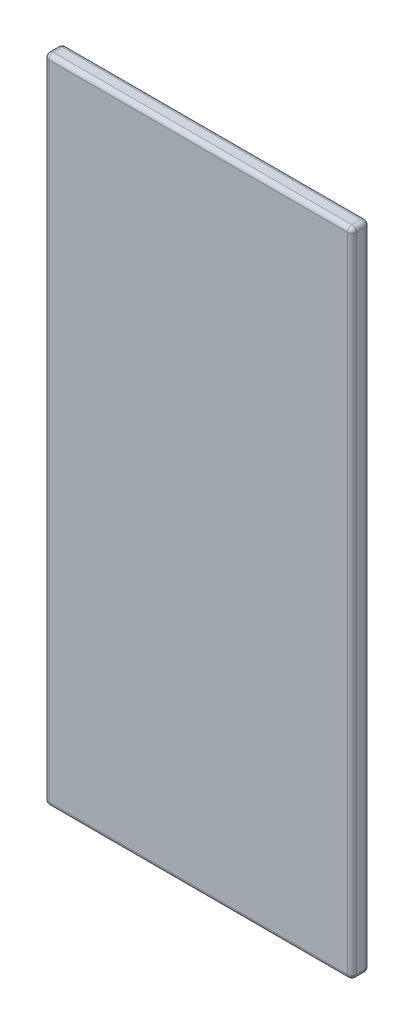
ISO-10303-21;
HEADER;
FILE_DESCRIPTION(('STEP AP214'),'2;1');
FILE_NAME('part.step','',(''),(''),'','','');
FILE_SCHEMA(('AUTOMOTIVE_DESIGN { 1 0 10303 214 1 1 1 1 }'));
ENDSEC;
DATA;
#1=APPLICATION_CONTEXT('core data for automotive mechanical design processes');
#2=APPLICATION_PROTOCOL_DEFINITION('international standard','automotive_design',2000,#1);
#3=PRODUCT_CONTEXT('',#1,'mechanical');
#4=PRODUCT('Part','Part','',(#3));
#5=PRODUCT_RELATED_PRODUCT_CATEGORY('part','',(#4));
#6=PRODUCT_DEFINITION_FORMATION('','',#4);
#7=PRODUCT_DEFINITION_CONTEXT('part definition',#1,'design');
#8=PRODUCT_DEFINITION('design','',#6,#7);
#9=PRODUCT_DEFINITION_SHAPE('','',#8);
#10=(LENGTH_UNIT() NAMED_UNIT(*) SI_UNIT(.MILLI.,.METRE.));
#11=(NAMED_UNIT(*) PLANE_ANGLE_UNIT() SI_UNIT($,.RADIAN.));
#12=(NAMED_UNIT(*) SI_UNIT($,.STERADIAN.) SOLID_ANGLE_UNIT());
#13=UNCERTAINTY_MEASURE_WITH_UNIT(LENGTH_MEASURE(1.E-05),#10,'distance_accuracy_value','');
#14=(GEOMETRIC_REPRESENTATION_CONTEXT(3) GLOBAL_UNCERTAINTY_ASSIGNED_CONTEXT((#13)) GLOBAL_UNIT_ASSIGNED_CONTEXT((#10,
#11,#12)) REPRESENTATION_CONTEXT('',''));
#15=CARTESIAN_POINT('',(0.,0.,0.));
#16=DIRECTION('',(0.,0.,1.));
#17=DIRECTION('',(1.,0.,0.));
#18=AXIS2_PLACEMENT_3D('',#15,#16,#17);
#19=CARTESIAN_POINT('',(17.35,-36.75,2.));
#20=DIRECTION('',(-1.,0.,0.));
#21=DIRECTION('',(0.,0.,1.));
#22=AXIS2_PLACEMENT_3D('',#19,#20,#21);
#23=PLANE('',#22);
#24=DIRECTION('',(0.,1.,0.));
#25=VECTOR('',#24,1.);
#26=CARTESIAN_POINT('',(17.35,-36.75,1.5));
#27=LINE('',#26,#25);
#28=CARTESIAN_POINT('',(17.35,36.25,1.5));
#29=VERTEX_POINT('',#28);
#30=CARTESIAN_POINT('',(17.35,-36.25,1.5));
#31=VERTEX_POINT('',#30);
#32=EDGE_CURVE('E44',#29,#31,#27,.F.);
#33=ORIENTED_EDGE('',*,*,#32,.T.);
#34=DIRECTION('',(0.,0.,-1.));
#35=VECTOR('',#34,1.);
#36=CARTESIAN_POINT('',(17.35,-36.25,2.));
#37=LINE('',#36,#35);
#38=CARTESIAN_POINT('',(17.35,-36.25,0.5));
#39=VERTEX_POINT('',#38);
#40=EDGE_CURVE('E11',#31,#39,#37,.T.);
#41=ORIENTED_EDGE('',*,*,#40,.T.);
#42=DIRECTION('',(0.,1.,0.));
#43=VECTOR('',#42,1.);
#44=CARTESIAN_POINT('',(17.35,36.75,0.5));
#45=LINE('',#44,#43);
#46=CARTESIAN_POINT('',(17.35,36.25,0.5));
#47=VERTEX_POINT('',#46);
#48=EDGE_CURVE('E196',#39,#47,#45,.T.);
#49=ORIENTED_EDGE('',*,*,#48,.T.);
#50=DIRECTION('',(0.,0.,-1.));
#51=VECTOR('',#50,1.);
#52=CARTESIAN_POINT('',(17.35,36.25,2.));
#53=LINE('',#52,#51);
#54=EDGE_CURVE('E55',#47,#29,#53,.F.);
#55=ORIENTED_EDGE('',*,*,#54,.T.);
#56=EDGE_LOOP('',(#33,#41,#49,#55));
#57=FACE_BOUND('',#56,.T.);
#58=ADVANCED_FACE('F35',(#57),#23,.F.);
#59=CARTESIAN_POINT('',(-17.35,36.75,2.));
#60=DIRECTION('',(0.,-1.,0.));
#61=DIRECTION('',(0.,0.,-1.));
#62=AXIS2_PLACEMENT_3D('',#59,#60,#61);
#63=PLANE('',#62);
#64=DIRECTION('',(0.,0.,-1.));
#65=VECTOR('',#64,1.);
#66=CARTESIAN_POINT('',(-16.85,36.75,2.));
#67=LINE('',#66,#65);
#68=CARTESIAN_POINT('',(-16.85,36.75,0.5));
#69=VERTEX_POINT('',#68);
#70=CARTESIAN_POINT('',(-16.85,36.75,1.5));
#71=VERTEX_POINT('',#70);
#72=EDGE_CURVE('E191',#69,#71,#67,.F.);
#73=ORIENTED_EDGE('',*,*,#72,.T.);
#74=DIRECTION('',(-1.,0.,0.));
#75=VECTOR('',#74,1.);
#76=CARTESIAN_POINT('',(-17.35,36.75,1.5));
#77=LINE('',#76,#75);
#78=CARTESIAN_POINT('',(16.85,36.75,1.5));
#79=VERTEX_POINT('',#78);
#80=EDGE_CURVE('E193',#71,#79,#77,.F.);
#81=ORIENTED_EDGE('',*,*,#80,.T.);
#82=DIRECTION('',(0.,0.,-1.));
#83=VECTOR('',#82,1.);
#84=CARTESIAN_POINT('',(16.85,36.75,2.));
#85=LINE('',#84,#83);
#86=CARTESIAN_POINT('',(16.85,36.75,0.5));
#87=VERTEX_POINT('',#86);
#88=EDGE_CURVE('E187',#79,#87,#85,.T.);
#89=ORIENTED_EDGE('',*,*,#88,.T.);
#90=DIRECTION('',(-1.,0.,0.));
#91=VECTOR('',#90,1.);
#92=CARTESIAN_POINT('',(-17.35,36.75,0.5));
#93=LINE('',#92,#91);
#94=EDGE_CURVE('E189',#87,#69,#93,.T.);
#95=ORIENTED_EDGE('',*,*,#94,.T.);
#96=EDGE_LOOP('',(#73,#81,#89,#95));
#97=FACE_BOUND('',#96,.T.);
#98=ADVANCED_FACE('F280',(#97),#63,.F.);
#99=CARTESIAN_POINT('',(-17.35,-36.75,2.));
#100=DIRECTION('',(1.,0.,0.));
#101=DIRECTION('',(0.,0.,-1.));
#102=AXIS2_PLACEMENT_3D('',#99,#100,#101);
#103=PLANE('',#102);
#104=DIRECTION('',(0.,0.,-1.));
#105=VECTOR('',#104,1.);
#106=CARTESIAN_POINT('',(-17.35,-36.25,2.));
#107=LINE('',#106,#105);
#108=CARTESIAN_POINT('',(-17.35,-36.25,0.5));
#109=VERTEX_POINT('',#108);
#110=CARTESIAN_POINT('',(-17.35,-36.25,1.5));
#111=VERTEX_POINT('',#110);
#112=EDGE_CURVE('E182',#109,#111,#107,.F.);
#113=ORIENTED_EDGE('',*,*,#112,.T.);
#114=DIRECTION('',(0.,-1.,0.));
#115=VECTOR('',#114,1.);
#116=CARTESIAN_POINT('',(-17.35,-36.75,1.5));
#117=LINE('',#116,#115);
#118=CARTESIAN_POINT('',(-17.35,36.25,1.5));
#119=VERTEX_POINT('',#118);
#120=EDGE_CURVE('E184',#111,#119,#117,.F.);
#121=ORIENTED_EDGE('',*,*,#120,.T.);
#122=DIRECTION('',(0.,0.,-1.));
#123=VECTOR('',#122,1.);
#124=CARTESIAN_POINT('',(-17.35,36.25,2.));
#125=LINE('',#124,#123);
#126=CARTESIAN_POINT('',(-17.35,36.25,0.5));
#127=VERTEX_POINT('',#126);
#128=EDGE_CURVE('E178',#119,#127,#125,.T.);
#129=ORIENTED_EDGE('',*,*,#128,.T.);
#130=DIRECTION('',(0.,-1.,0.));
#131=VECTOR('',#130,1.);
#132=CARTESIAN_POINT('',(-17.35,-36.75,0.5));
#133=LINE('',#132,#131);
#134=EDGE_CURVE('E180',#127,#109,#133,.T.);
#135=ORIENTED_EDGE('',*,*,#134,.T.);
#136=EDGE_LOOP('',(#113,#121,#129,#135));
#137=FACE_BOUND('',#136,.T.);
#138=ADVANCED_FACE('F271',(#137),#103,.F.);
#139=CARTESIAN_POINT('',(-17.35,-36.75,2.));
#140=DIRECTION('',(0.,1.,0.));
#141=DIRECTION('',(0.,0.,1.));
#142=AXIS2_PLACEMENT_3D('',#139,#140,#141);
#143=PLANE('',#142);
#144=DIRECTION('',(1.,0.,0.));
#145=VECTOR('',#144,1.);
#146=CARTESIAN_POINT('',(-17.35,-36.75,1.5));
#147=LINE('',#146,#145);
#148=CARTESIAN_POINT('',(16.85,-36.75,1.5));
#149=VERTEX_POINT('',#148);
#150=CARTESIAN_POINT('',(-16.85,-36.75,1.5));
#151=VERTEX_POINT('',#150);
#152=EDGE_CURVE('E131',#149,#151,#147,.F.);
#153=ORIENTED_EDGE('',*,*,#152,.T.);
#154=DIRECTION('',(0.,0.,-1.));
#155=VECTOR('',#154,1.);
#156=CARTESIAN_POINT('',(-16.85,-36.75,2.));
#157=LINE('',#156,#155);
#158=CARTESIAN_POINT('',(-16.85,-36.75,0.5));
#159=VERTEX_POINT('',#158);
#160=EDGE_CURVE('E167',#151,#159,#157,.T.);
#161=ORIENTED_EDGE('',*,*,#160,.T.);
#162=DIRECTION('',(1.,0.,0.));
#163=VECTOR('',#162,1.);
#164=CARTESIAN_POINT('',(17.35,-36.75,0.5));
#165=LINE('',#164,#163);
#166=CARTESIAN_POINT('',(16.85,-36.75,0.5));
#167=VERTEX_POINT('',#166);
#168=EDGE_CURVE('E160',#159,#167,#165,.T.);
#169=ORIENTED_EDGE('',*,*,#168,.T.);
#170=DIRECTION('',(0.,0.,-1.));
#171=VECTOR('',#170,1.);
#172=CARTESIAN_POINT('',(16.85,-36.75,2.));
#173=LINE('',#172,#171);
#174=EDGE_CURVE('E158',#167,#149,#173,.F.);
#175=ORIENTED_EDGE('',*,*,#174,.T.);
#176=EDGE_LOOP('',(#153,#161,#169,#175));
#177=FACE_BOUND('',#176,.T.);
#178=ADVANCED_FACE('F358',(#177),#143,.F.);
#179=CARTESIAN_POINT('',(0.,0.,2.));
#180=DIRECTION('',(0.,0.,-1.));
#181=DIRECTION('',(-1.,0.,0.));
#182=AXIS2_PLACEMENT_3D('',#179,#180,#181);
#183=PLANE('',#182);
#184=DIRECTION('',(0.,-1.,0.));
#185=VECTOR('',#184,1.);
#186=CARTESIAN_POINT('',(-16.85,0.,2.));
#187=LINE('',#186,#185);
#188=CARTESIAN_POINT('',(-16.85,36.25,2.));
#189=VERTEX_POINT('',#188);
#190=CARTESIAN_POINT('',(-16.85,-36.25,2.));
#191=VERTEX_POINT('',#190);
#192=EDGE_CURVE('E156',#189,#191,#187,.T.);
#193=ORIENTED_EDGE('',*,*,#192,.T.);
#194=DIRECTION('',(1.,0.,0.));
#195=VECTOR('',#194,1.);
#196=CARTESIAN_POINT('',(0.,-36.25,2.));
#197=LINE('',#196,#195);
#198=CARTESIAN_POINT('',(16.85,-36.25,2.));
#199=VERTEX_POINT('',#198);
#200=EDGE_CURVE('E129',#191,#199,#197,.T.);
#201=ORIENTED_EDGE('',*,*,#200,.T.);
#202=DIRECTION('',(0.,1.,0.));
#203=VECTOR('',#202,1.);
#204=CARTESIAN_POINT('',(16.85,0.,2.));
#205=LINE('',#204,#203);
#206=CARTESIAN_POINT('',(16.85,36.25,2.));
#207=VERTEX_POINT('',#206);
#208=EDGE_CURVE('E146',#199,#207,#205,.T.);
#209=ORIENTED_EDGE('',*,*,#208,.T.);
#210=DIRECTION('',(-1.,0.,0.));
#211=VECTOR('',#210,1.);
#212=CARTESIAN_POINT('',(0.,36.25,2.));
#213=LINE('',#212,#211);
#214=EDGE_CURVE('E152',#207,#189,#213,.T.);
#215=ORIENTED_EDGE('',*,*,#214,.T.);
#216=EDGE_LOOP('',(#193,#201,#209,#215));
#217=FACE_BOUND('',#216,.T.);
#218=ADVANCED_FACE('F154',(#217),#183,.F.);
#219=CARTESIAN_POINT('',(0.,0.,0.));
#220=DIRECTION('',(0.,0.,-1.));
#221=DIRECTION('',(-1.,0.,0.));
#222=AXIS2_PLACEMENT_3D('',#219,#220,#221);
#223=PLANE('',#222);
#224=DIRECTION('',(0.,1.,0.));
#225=VECTOR('',#224,1.);
#226=CARTESIAN_POINT('',(16.85,-36.75,0.));
#227=LINE('',#226,#225);
#228=CARTESIAN_POINT('',(16.85,36.25,0.));
#229=VERTEX_POINT('',#228);
#230=CARTESIAN_POINT('',(16.85,-36.25,0.));
#231=VERTEX_POINT('',#230);
#232=EDGE_CURVE('E169',#229,#231,#227,.F.);
#233=ORIENTED_EDGE('',*,*,#232,.T.);
#234=DIRECTION('',(1.,0.,0.));
#235=VECTOR('',#234,1.);
#236=CARTESIAN_POINT('',(-17.35,-36.25,0.));
#237=LINE('',#236,#235);
#238=CARTESIAN_POINT('',(-16.85,-36.25,0.));
#239=VERTEX_POINT('',#238);
#240=EDGE_CURVE('E175',#231,#239,#237,.F.);
#241=ORIENTED_EDGE('',*,*,#240,.T.);
#242=DIRECTION('',(0.,-1.,0.));
#243=VECTOR('',#242,1.);
#244=CARTESIAN_POINT('',(-16.85,36.75,0.));
#245=LINE('',#244,#243);
#246=CARTESIAN_POINT('',(-16.85,36.25,0.));
#247=VERTEX_POINT('',#246);
#248=EDGE_CURVE('E173',#239,#247,#245,.F.);
#249=ORIENTED_EDGE('',*,*,#248,.T.);
#250=DIRECTION('',(-1.,0.,0.));
#251=VECTOR('',#250,1.);
#252=CARTESIAN_POINT('',(17.35,36.25,0.));
#253=LINE('',#252,#251);
#254=EDGE_CURVE('E171',#247,#229,#253,.F.);
#255=ORIENTED_EDGE('',*,*,#254,.T.);
#256=EDGE_LOOP('',(#233,#241,#249,#255));
#257=FACE_BOUND('',#256,.T.);
#258=ADVANCED_FACE('F298',(#257),#223,.T.);
#259=CARTESIAN_POINT('',(-17.35,36.25,0.5));
#260=DIRECTION('',(1.,0.,0.));
#261=DIRECTION('',(0.,0.,-1.));
#262=AXIS2_PLACEMENT_3D('',#259,#260,#261);
#263=CYLINDRICAL_SURFACE('',#262,0.5);
#264=CARTESIAN_POINT('',(-16.85,36.25,0.5));
#265=DIRECTION('',(-1.,0.,0.));
#266=DIRECTION('',(0.,0.,1.));
#267=AXIS2_PLACEMENT_3D('',#264,#265,#266);
#268=CIRCLE('',#267,0.5);
#269=EDGE_CURVE('E39',#69,#247,#268,.T.);
#270=ORIENTED_EDGE('',*,*,#269,.F.);
#271=ORIENTED_EDGE('',*,*,#94,.F.);
#272=CARTESIAN_POINT('',(16.85,36.25,0.5));
#273=DIRECTION('',(1.,0.,0.));
#274=DIRECTION('',(0.,0.,-1.));
#275=AXIS2_PLACEMENT_3D('',#272,#273,#274);
#276=CIRCLE('',#275,0.5);
#277=EDGE_CURVE('E248',#229,#87,#276,.T.);
#278=ORIENTED_EDGE('',*,*,#277,.F.);
#279=ORIENTED_EDGE('',*,*,#254,.F.);
#280=EDGE_LOOP('',(#270,#271,#278,#279));
#281=FACE_BOUND('',#280,.T.);
#282=ADVANCED_FACE('F37',(#281),#263,.T.);
#283=CARTESIAN_POINT('',(-16.85,36.25,0.5));
#284=DIRECTION('',(0.,0.,1.));
#285=DIRECTION('',(1.,0.,0.));
#286=AXIS2_PLACEMENT_3D('',#283,#284,#285);
#287=SPHERICAL_SURFACE('',#286,0.5);
#288=CARTESIAN_POINT('',(-16.85,36.25,0.5));
#289=DIRECTION('',(0.,0.,-1.));
#290=DIRECTION('',(-1.,0.,0.));
#291=AXIS2_PLACEMENT_3D('',#288,#289,#290);
#292=CIRCLE('',#291,0.5);
#293=EDGE_CURVE('E243',#69,#127,#292,.F.);
#294=ORIENTED_EDGE('',*,*,#293,.F.);
#295=ORIENTED_EDGE('',*,*,#269,.T.);
#296=CARTESIAN_POINT('',(-16.85,36.25,0.5));
#297=DIRECTION('',(0.,1.,0.));
#298=DIRECTION('',(0.,0.,1.));
#299=AXIS2_PLACEMENT_3D('',#296,#297,#298);
#300=CIRCLE('',#299,0.5);
#301=EDGE_CURVE('E246',#127,#247,#300,.F.);
#302=ORIENTED_EDGE('',*,*,#301,.F.);
#303=EDGE_LOOP('',(#294,#295,#302));
#304=FACE_BOUND('',#303,.T.);
#305=ADVANCED_FACE('F259',(#304),#287,.T.);
#306=CARTESIAN_POINT('',(16.85,36.25,0.5));
#307=DIRECTION('',(0.,0.,1.));
#308=DIRECTION('',(1.,0.,0.));
#309=AXIS2_PLACEMENT_3D('',#306,#307,#308);
#310=SPHERICAL_SURFACE('',#309,0.5);
#311=CARTESIAN_POINT('',(16.85,36.25,0.5));
#312=DIRECTION('',(0.,1.,0.));
#313=DIRECTION('',(0.,0.,1.));
#314=AXIS2_PLACEMENT_3D('',#311,#312,#313);
#315=CIRCLE('',#314,0.5);
#316=EDGE_CURVE('E237',#229,#47,#315,.F.);
#317=ORIENTED_EDGE('',*,*,#316,.F.);
#318=ORIENTED_EDGE('',*,*,#277,.T.);
#319=CARTESIAN_POINT('',(16.85,36.25,0.5));
#320=DIRECTION('',(0.,0.,-1.));
#321=DIRECTION('',(-1.,0.,0.));
#322=AXIS2_PLACEMENT_3D('',#319,#320,#321);
#323=CIRCLE('',#322,0.5);
#324=EDGE_CURVE('E240',#47,#87,#323,.F.);
#325=ORIENTED_EDGE('',*,*,#324,.F.);
#326=EDGE_LOOP('',(#317,#318,#325));
#327=FACE_BOUND('',#326,.T.);
#328=ADVANCED_FACE('F291',(#327),#310,.T.);
#329=CARTESIAN_POINT('',(-16.85,-36.75,0.5));
#330=DIRECTION('',(0.,1.,0.));
#331=DIRECTION('',(0.,0.,1.));
#332=AXIS2_PLACEMENT_3D('',#329,#330,#331);
#333=CYLINDRICAL_SURFACE('',#332,0.5);
#334=ORIENTED_EDGE('',*,*,#301,.T.);
#335=ORIENTED_EDGE('',*,*,#248,.F.);
#336=CARTESIAN_POINT('',(-16.85,-36.25,0.5));
#337=DIRECTION('',(0.,-1.,0.));
#338=DIRECTION('',(0.,0.,-1.));
#339=AXIS2_PLACEMENT_3D('',#336,#337,#338);
#340=CIRCLE('',#339,0.5);
#341=EDGE_CURVE('E232',#109,#239,#340,.T.);
#342=ORIENTED_EDGE('',*,*,#341,.F.);
#343=ORIENTED_EDGE('',*,*,#134,.F.);
#344=EDGE_LOOP('',(#334,#335,#342,#343));
#345=FACE_BOUND('',#344,.T.);
#346=ADVANCED_FACE('F267',(#345),#333,.T.);
#347=CARTESIAN_POINT('',(-16.85,36.25,2.));
#348=DIRECTION('',(0.,0.,-1.));
#349=DIRECTION('',(-1.,0.,0.));
#350=AXIS2_PLACEMENT_3D('',#347,#348,#349);
#351=CYLINDRICAL_SURFACE('',#350,0.5);
#352=ORIENTED_EDGE('',*,*,#293,.T.);
#353=ORIENTED_EDGE('',*,*,#128,.F.);
#354=CARTESIAN_POINT('',(-16.85,36.25,1.5));
#355=DIRECTION('',(0.,0.,1.));
#356=DIRECTION('',(1.,0.,0.));
#357=AXIS2_PLACEMENT_3D('',#354,#355,#356);
#358=CIRCLE('',#357,0.5);
#359=EDGE_CURVE('E229',#71,#119,#358,.T.);
#360=ORIENTED_EDGE('',*,*,#359,.F.);
#361=ORIENTED_EDGE('',*,*,#72,.F.);
#362=EDGE_LOOP('',(#352,#353,#360,#361));
#363=FACE_BOUND('',#362,.T.);
#364=ADVANCED_FACE('F277',(#363),#351,.T.);
#365=CARTESIAN_POINT('',(0.,36.25,1.5));
#366=DIRECTION('',(-1.,0.,0.));
#367=DIRECTION('',(0.,0.,1.));
#368=AXIS2_PLACEMENT_3D('',#365,#366,#367);
#369=CYLINDRICAL_SURFACE('',#368,0.5);
#370=CARTESIAN_POINT('',(16.85,36.25,1.5));
#371=DIRECTION('',(1.,0.,0.));
#372=DIRECTION('',(0.,0.,-1.));
#373=AXIS2_PLACEMENT_3D('',#370,#371,#372);
#374=CIRCLE('',#373,0.5);
#375=EDGE_CURVE('E223',#79,#207,#374,.T.);
#376=ORIENTED_EDGE('',*,*,#375,.F.);
#377=ORIENTED_EDGE('',*,*,#80,.F.);
#378=CARTESIAN_POINT('',(-16.85,36.25,1.5));
#379=DIRECTION('',(-1.,0.,0.));
#380=DIRECTION('',(0.,0.,1.));
#381=AXIS2_PLACEMENT_3D('',#378,#379,#380);
#382=CIRCLE('',#381,0.5);
#383=EDGE_CURVE('E226',#189,#71,#382,.T.);
#384=ORIENTED_EDGE('',*,*,#383,.F.);
#385=ORIENTED_EDGE('',*,*,#214,.F.);
#386=EDGE_LOOP('',(#376,#377,#384,#385));
#387=FACE_BOUND('',#386,.T.);
#388=ADVANCED_FACE('F284',(#387),#369,.T.);
#389=CARTESIAN_POINT('',(16.85,36.25,2.));
#390=DIRECTION('',(0.,0.,-1.));
#391=DIRECTION('',(-1.,0.,0.));
#392=AXIS2_PLACEMENT_3D('',#389,#390,#391);
#393=CYLINDRICAL_SURFACE('',#392,0.5);
#394=ORIENTED_EDGE('',*,*,#324,.T.);
#395=ORIENTED_EDGE('',*,*,#88,.F.);
#396=CARTESIAN_POINT('',(16.85,36.25,1.5));
#397=DIRECTION('',(0.,0.,1.));
#398=DIRECTION('',(1.,0.,0.));
#399=AXIS2_PLACEMENT_3D('',#396,#397,#398);
#400=CIRCLE('',#399,0.5);
#401=EDGE_CURVE('E221',#29,#79,#400,.T.);
#402=ORIENTED_EDGE('',*,*,#401,.F.);
#403=ORIENTED_EDGE('',*,*,#54,.F.);
#404=EDGE_LOOP('',(#394,#395,#402,#403));
#405=FACE_BOUND('',#404,.T.);
#406=ADVANCED_FACE('F289',(#405),#393,.T.);
#407=CARTESIAN_POINT('',(16.85,-36.75,0.5));
#408=DIRECTION('',(0.,-1.,0.));
#409=DIRECTION('',(0.,0.,-1.));
#410=AXIS2_PLACEMENT_3D('',#407,#408,#409);
#411=CYLINDRICAL_SURFACE('',#410,0.5);
#412=ORIENTED_EDGE('',*,*,#316,.T.);
#413=ORIENTED_EDGE('',*,*,#48,.F.);
#414=CARTESIAN_POINT('',(16.85,-36.25,0.5));
#415=DIRECTION('',(0.,-1.,0.));
#416=DIRECTION('',(0.,0.,-1.));
#417=AXIS2_PLACEMENT_3D('',#414,#415,#416);
#418=CIRCLE('',#417,0.5);
#419=EDGE_CURVE('E218',#231,#39,#418,.T.);
#420=ORIENTED_EDGE('',*,*,#419,.F.);
#421=ORIENTED_EDGE('',*,*,#232,.F.);
#422=EDGE_LOOP('',(#412,#413,#420,#421));
#423=FACE_BOUND('',#422,.T.);
#424=ADVANCED_FACE('F295',(#423),#411,.T.);
#425=CARTESIAN_POINT('',(-17.35,-36.25,0.5));
#426=DIRECTION('',(-1.,0.,0.));
#427=DIRECTION('',(0.,0.,1.));
#428=AXIS2_PLACEMENT_3D('',#425,#426,#427);
#429=CYLINDRICAL_SURFACE('',#428,0.5);
#430=CARTESIAN_POINT('',(-16.85,-36.25,0.5));
#431=DIRECTION('',(-1.,0.,0.));
#432=DIRECTION('',(0.,0.,1.));
#433=AXIS2_PLACEMENT_3D('',#430,#431,#432);
#434=CIRCLE('',#433,0.5);
#435=EDGE_CURVE('E234',#239,#159,#434,.T.);
#436=ORIENTED_EDGE('',*,*,#435,.F.);
#437=ORIENTED_EDGE('',*,*,#240,.F.);
#438=CARTESIAN_POINT('',(16.85,-36.25,0.5));
#439=DIRECTION('',(1.,0.,0.));
#440=DIRECTION('',(0.,0.,-1.));
#441=AXIS2_PLACEMENT_3D('',#438,#439,#440);
#442=CIRCLE('',#441,0.5);
#443=EDGE_CURVE('E215',#167,#231,#442,.T.);
#444=ORIENTED_EDGE('',*,*,#443,.F.);
#445=ORIENTED_EDGE('',*,*,#168,.F.);
#446=EDGE_LOOP('',(#436,#437,#444,#445));
#447=FACE_BOUND('',#446,.T.);
#448=ADVANCED_FACE('F302',(#447),#429,.T.);
#449=CARTESIAN_POINT('',(-16.85,-36.25,0.5));
#450=DIRECTION('',(0.,0.,1.));
#451=DIRECTION('',(1.,0.,0.));
#452=AXIS2_PLACEMENT_3D('',#449,#450,#451);
#453=SPHERICAL_SURFACE('',#452,0.5);
#454=ORIENTED_EDGE('',*,*,#341,.T.);
#455=ORIENTED_EDGE('',*,*,#435,.T.);
#456=CARTESIAN_POINT('',(-16.85,-36.25,0.5));
#457=DIRECTION('',(0.,0.,-1.));
#458=DIRECTION('',(-1.,0.,0.));
#459=AXIS2_PLACEMENT_3D('',#456,#457,#458);
#460=CIRCLE('',#459,0.5);
#461=EDGE_CURVE('E212',#109,#159,#460,.F.);
#462=ORIENTED_EDGE('',*,*,#461,.F.);
#463=EDGE_LOOP('',(#454,#455,#462));
#464=FACE_BOUND('',#463,.T.);
#465=ADVANCED_FACE('F306',(#464),#453,.T.);
#466=CARTESIAN_POINT('',(-16.85,36.25,1.5));
#467=DIRECTION('',(0.,0.,1.));
#468=DIRECTION('',(1.,0.,0.));
#469=AXIS2_PLACEMENT_3D('',#466,#467,#468);
#470=SPHERICAL_SURFACE('',#469,0.5);
#471=ORIENTED_EDGE('',*,*,#383,.T.);
#472=ORIENTED_EDGE('',*,*,#359,.T.);
#473=CARTESIAN_POINT('',(-16.85,36.25,1.5));
#474=DIRECTION('',(0.,1.,0.));
#475=DIRECTION('',(0.,0.,1.));
#476=AXIS2_PLACEMENT_3D('',#473,#474,#475);
#477=CIRCLE('',#476,0.5);
#478=EDGE_CURVE('E210',#189,#119,#477,.F.);
#479=ORIENTED_EDGE('',*,*,#478,.F.);
#480=EDGE_LOOP('',(#471,#472,#479));
#481=FACE_BOUND('',#480,.T.);
#482=ADVANCED_FACE('F317',(#481),#470,.T.);
#483=CARTESIAN_POINT('',(16.85,36.25,1.5));
#484=DIRECTION('',(0.,0.,1.));
#485=DIRECTION('',(1.,0.,0.));
#486=AXIS2_PLACEMENT_3D('',#483,#484,#485);
#487=SPHERICAL_SURFACE('',#486,0.5);
#488=ORIENTED_EDGE('',*,*,#401,.T.);
#489=ORIENTED_EDGE('',*,*,#375,.T.);
#490=CARTESIAN_POINT('',(16.85,36.25,1.5));
#491=DIRECTION('',(0.,1.,0.));
#492=DIRECTION('',(0.,0.,1.));
#493=AXIS2_PLACEMENT_3D('',#490,#491,#492);
#494=CIRCLE('',#493,0.5);
#495=EDGE_CURVE('E149',#29,#207,#494,.F.);
#496=ORIENTED_EDGE('',*,*,#495,.F.);
#497=EDGE_LOOP('',(#488,#489,#496));
#498=FACE_BOUND('',#497,.T.);
#499=ADVANCED_FACE('F319',(#498),#487,.T.);
#500=CARTESIAN_POINT('',(16.85,-36.25,0.5));
#501=DIRECTION('',(0.,0.,1.));
#502=DIRECTION('',(1.,0.,0.));
#503=AXIS2_PLACEMENT_3D('',#500,#501,#502);
#504=SPHERICAL_SURFACE('',#503,0.5);
#505=ORIENTED_EDGE('',*,*,#443,.T.);
#506=ORIENTED_EDGE('',*,*,#419,.T.);
#507=CARTESIAN_POINT('',(16.85,-36.25,0.5));
#508=DIRECTION('',(0.,0.,-1.));
#509=DIRECTION('',(-1.,0.,0.));
#510=AXIS2_PLACEMENT_3D('',#507,#508,#509);
#511=CIRCLE('',#510,0.5);
#512=EDGE_CURVE('E207',#167,#39,#511,.F.);
#513=ORIENTED_EDGE('',*,*,#512,.F.);
#514=EDGE_LOOP('',(#505,#506,#513));
#515=FACE_BOUND('',#514,.T.);
#516=ADVANCED_FACE('F325',(#515),#504,.T.);
#517=CARTESIAN_POINT('',(-16.85,-36.25,2.));
#518=DIRECTION('',(0.,0.,-1.));
#519=DIRECTION('',(-1.,0.,0.));
#520=AXIS2_PLACEMENT_3D('',#517,#518,#519);
#521=CYLINDRICAL_SURFACE('',#520,0.5);
#522=ORIENTED_EDGE('',*,*,#461,.T.);
#523=ORIENTED_EDGE('',*,*,#160,.F.);
#524=CARTESIAN_POINT('',(-16.85,-36.25,1.5));
#525=DIRECTION('',(0.,0.,1.));
#526=DIRECTION('',(1.,0.,0.));
#527=AXIS2_PLACEMENT_3D('',#524,#525,#526);
#528=CIRCLE('',#527,0.5);
#529=EDGE_CURVE('E204',#111,#151,#528,.T.);
#530=ORIENTED_EDGE('',*,*,#529,.F.);
#531=ORIENTED_EDGE('',*,*,#112,.F.);
#532=EDGE_LOOP('',(#522,#523,#530,#531));
#533=FACE_BOUND('',#532,.T.);
#534=ADVANCED_FACE('F309',(#533),#521,.T.);
#535=CARTESIAN_POINT('',(-16.85,0.,1.5));
#536=DIRECTION('',(0.,-1.,0.));
#537=DIRECTION('',(0.,0.,-1.));
#538=AXIS2_PLACEMENT_3D('',#535,#536,#537);
#539=CYLINDRICAL_SURFACE('',#538,0.5);
#540=ORIENTED_EDGE('',*,*,#478,.T.);
#541=ORIENTED_EDGE('',*,*,#120,.F.);
#542=CARTESIAN_POINT('',(-16.85,-36.25,1.5));
#543=DIRECTION('',(0.,-1.,0.));
#544=DIRECTION('',(0.,0.,-1.));
#545=AXIS2_PLACEMENT_3D('',#542,#543,#544);
#546=CIRCLE('',#545,0.5);
#547=EDGE_CURVE('E143',#191,#111,#546,.T.);
#548=ORIENTED_EDGE('',*,*,#547,.F.);
#549=ORIENTED_EDGE('',*,*,#192,.F.);
#550=EDGE_LOOP('',(#540,#541,#548,#549));
#551=FACE_BOUND('',#550,.T.);
#552=ADVANCED_FACE('F315',(#551),#539,.T.);
#553=CARTESIAN_POINT('',(16.85,0.,1.5));
#554=DIRECTION('',(0.,1.,0.));
#555=DIRECTION('',(0.,0.,1.));
#556=AXIS2_PLACEMENT_3D('',#553,#554,#555);
#557=CYLINDRICAL_SURFACE('',#556,0.5);
#558=ORIENTED_EDGE('',*,*,#495,.T.);
#559=ORIENTED_EDGE('',*,*,#208,.F.);
#560=CARTESIAN_POINT('',(16.85,-36.25,1.5));
#561=DIRECTION('',(0.,-1.,0.));
#562=DIRECTION('',(0.,0.,-1.));
#563=AXIS2_PLACEMENT_3D('',#560,#561,#562);
#564=CIRCLE('',#563,0.5);
#565=EDGE_CURVE('E137',#31,#199,#564,.T.);
#566=ORIENTED_EDGE('',*,*,#565,.F.);
#567=ORIENTED_EDGE('',*,*,#32,.F.);
#568=EDGE_LOOP('',(#558,#559,#566,#567));
#569=FACE_BOUND('',#568,.T.);
#570=ADVANCED_FACE('F147',(#569),#557,.T.);
#571=CARTESIAN_POINT('',(16.85,-36.25,2.));
#572=DIRECTION('',(0.,0.,-1.));
#573=DIRECTION('',(-1.,0.,0.));
#574=AXIS2_PLACEMENT_3D('',#571,#572,#573);
#575=CYLINDRICAL_SURFACE('',#574,0.5);
#576=ORIENTED_EDGE('',*,*,#512,.T.);
#577=ORIENTED_EDGE('',*,*,#40,.F.);
#578=CARTESIAN_POINT('',(16.85,-36.25,1.5));
#579=DIRECTION('',(0.,0.,1.));
#580=DIRECTION('',(1.,0.,0.));
#581=AXIS2_PLACEMENT_3D('',#578,#579,#580);
#582=CIRCLE('',#581,0.5);
#583=EDGE_CURVE('E141',#149,#31,#582,.T.);
#584=ORIENTED_EDGE('',*,*,#583,.F.);
#585=ORIENTED_EDGE('',*,*,#174,.F.);
#586=EDGE_LOOP('',(#576,#577,#584,#585));
#587=FACE_BOUND('',#586,.T.);
#588=ADVANCED_FACE('F342',(#587),#575,.T.);
#589=CARTESIAN_POINT('',(-16.85,-36.25,1.5));
#590=DIRECTION('',(0.,0.,1.));
#591=DIRECTION('',(1.,0.,0.));
#592=AXIS2_PLACEMENT_3D('',#589,#590,#591);
#593=SPHERICAL_SURFACE('',#592,0.5);
#594=ORIENTED_EDGE('',*,*,#547,.T.);
#595=ORIENTED_EDGE('',*,*,#529,.T.);
#596=CARTESIAN_POINT('',(-16.85,-36.25,1.5));
#597=DIRECTION('',(-1.,0.,0.));
#598=DIRECTION('',(0.,0.,1.));
#599=AXIS2_PLACEMENT_3D('',#596,#597,#598);
#600=CIRCLE('',#599,0.5);
#601=EDGE_CURVE('E134',#191,#151,#600,.F.);
#602=ORIENTED_EDGE('',*,*,#601,.F.);
#603=EDGE_LOOP('',(#594,#595,#602));
#604=FACE_BOUND('',#603,.T.);
#605=ADVANCED_FACE('F313',(#604),#593,.T.);
#606=CARTESIAN_POINT('',(16.85,-36.25,1.5));
#607=DIRECTION('',(0.,0.,1.));
#608=DIRECTION('',(1.,0.,0.));
#609=AXIS2_PLACEMENT_3D('',#606,#607,#608);
#610=SPHERICAL_SURFACE('',#609,0.5);
#611=ORIENTED_EDGE('',*,*,#583,.T.);
#612=ORIENTED_EDGE('',*,*,#565,.T.);
#613=CARTESIAN_POINT('',(16.85,-36.25,1.5));
#614=DIRECTION('',(1.,0.,0.));
#615=DIRECTION('',(0.,0.,-1.));
#616=AXIS2_PLACEMENT_3D('',#613,#614,#615);
#617=CIRCLE('',#616,0.5);
#618=EDGE_CURVE('E125',#149,#199,#617,.F.);
#619=ORIENTED_EDGE('',*,*,#618,.F.);
#620=EDGE_LOOP('',(#611,#612,#619));
#621=FACE_BOUND('',#620,.T.);
#622=ADVANCED_FACE('F139',(#621),#610,.T.);
#623=CARTESIAN_POINT('',(0.,-36.25,1.5));
#624=DIRECTION('',(1.,0.,0.));
#625=DIRECTION('',(0.,0.,-1.));
#626=AXIS2_PLACEMENT_3D('',#623,#624,#625);
#627=CYLINDRICAL_SURFACE('',#626,0.5);
#628=ORIENTED_EDGE('',*,*,#601,.T.);
#629=ORIENTED_EDGE('',*,*,#152,.F.);
#630=ORIENTED_EDGE('',*,*,#618,.T.);
#631=ORIENTED_EDGE('',*,*,#200,.F.);
#632=EDGE_LOOP('',(#628,#629,#630,#631));
#633=FACE_BOUND('',#632,.T.);
#634=ADVANCED_FACE('F127',(#633),#627,.T.);
#635=CLOSED_SHELL('',(#58,#98,#138,#178,#218,#258,#282,#305,#328,#346,#364,#388,#406,#424,#448,
#465,#482,#499,#516,#534,#552,#570,#588,#605,#622,#634));
#636=MANIFOLD_SOLID_BREP('B2',#635);
#637=ADVANCED_BREP_SHAPE_REPRESENTATION('',(#18,#636),#14);
#638=SHAPE_DEFINITION_REPRESENTATION(#9,#637);
ENDSEC;
END-ISO-10303-21;
